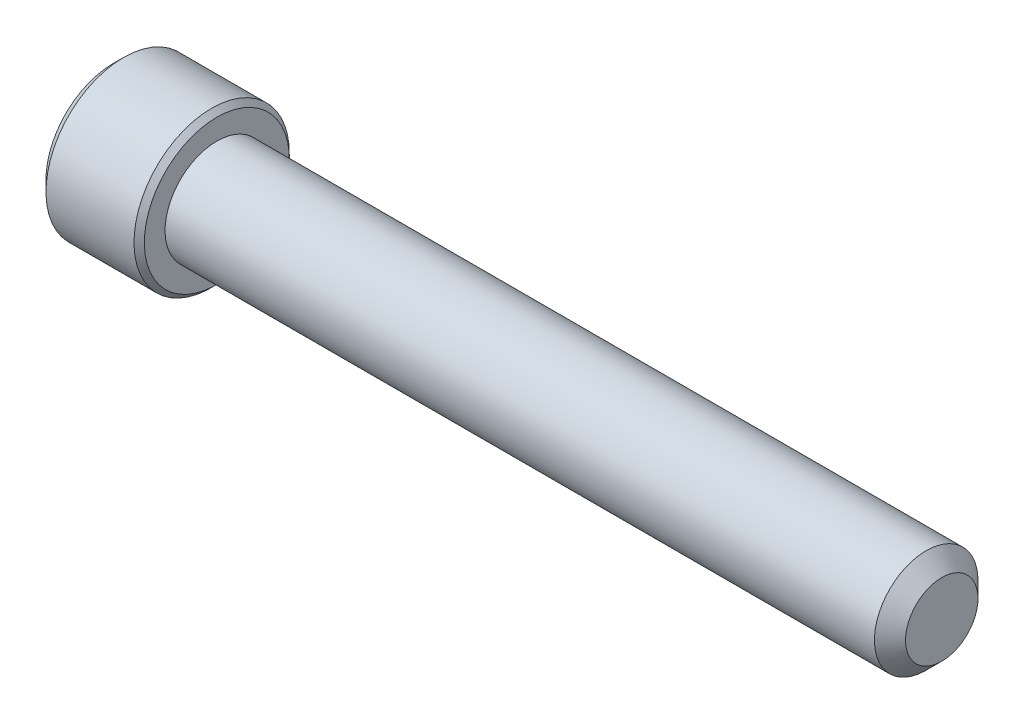
ISO-10303-21;
HEADER;
FILE_DESCRIPTION(('STEP AP214'),'2;1');
FILE_NAME('part.step','',(''),(''),'','','');
FILE_SCHEMA(('AUTOMOTIVE_DESIGN { 1 0 10303 214 1 1 1 1 }'));
ENDSEC;
DATA;
#1=APPLICATION_CONTEXT('core data for automotive mechanical design processes');
#2=APPLICATION_PROTOCOL_DEFINITION('international standard','automotive_design',2000,#1);
#3=PRODUCT_CONTEXT('',#1,'mechanical');
#4=PRODUCT('Part','Part','',(#3));
#5=PRODUCT_RELATED_PRODUCT_CATEGORY('part','',(#4));
#6=PRODUCT_DEFINITION_FORMATION('','',#4);
#7=PRODUCT_DEFINITION_CONTEXT('part definition',#1,'design');
#8=PRODUCT_DEFINITION('design','',#6,#7);
#9=PRODUCT_DEFINITION_SHAPE('','',#8);
#10=(LENGTH_UNIT() NAMED_UNIT(*) SI_UNIT(.MILLI.,.METRE.));
#11=(NAMED_UNIT(*) PLANE_ANGLE_UNIT() SI_UNIT($,.RADIAN.));
#12=(NAMED_UNIT(*) SI_UNIT($,.STERADIAN.) SOLID_ANGLE_UNIT());
#13=UNCERTAINTY_MEASURE_WITH_UNIT(LENGTH_MEASURE(1.E-05),#10,'distance_accuracy_value','');
#14=(GEOMETRIC_REPRESENTATION_CONTEXT(3) GLOBAL_UNCERTAINTY_ASSIGNED_CONTEXT((#13)) GLOBAL_UNIT_ASSIGNED_CONTEXT((#10,
#11,#12)) REPRESENTATION_CONTEXT('',''));
#15=CARTESIAN_POINT('',(0.,0.,0.));
#16=DIRECTION('',(0.,0.,1.));
#17=DIRECTION('',(1.,0.,0.));
#18=AXIS2_PLACEMENT_3D('',#15,#16,#17);
#19=CARTESIAN_POINT('',(-28.575,4.12749999999999,0.));
#20=DIRECTION('',(-1.,0.,0.));
#21=DIRECTION('',(0.,-1.,0.));
#22=AXIS2_PLACEMENT_3D('',#19,#20,#21);
#23=PLANE('',#22);
#24=CARTESIAN_POINT('',(-28.575,0.,0.));
#25=DIRECTION('',(-1.,0.,0.));
#26=DIRECTION('',(0.,-1.,0.));
#27=AXIS2_PLACEMENT_3D('',#24,#25,#26);
#28=CIRCLE('',#27,2.74963065701554);
#29=CARTESIAN_POINT('',(-28.575,-2.74963065701548,-1.90169061053957E-13));
#30=VERTEX_POINT('',#29);
#31=CARTESIAN_POINT('',(-28.575,-1.37481532850788,2.38124999999986));
#32=VERTEX_POINT('',#31);
#33=EDGE_CURVE('E136',#30,#32,#28,.T.);
#34=ORIENTED_EDGE('',*,*,#33,.F.);
#35=CARTESIAN_POINT('',(-28.575,-1.3748153285078,-2.38125));
#36=VERTEX_POINT('',#35);
#37=EDGE_CURVE('E135',#36,#30,#28,.T.);
#38=ORIENTED_EDGE('',*,*,#37,.F.);
#39=CARTESIAN_POINT('',(-28.575,1.37481532850774,-2.38125));
#40=VERTEX_POINT('',#39);
#41=EDGE_CURVE('E105',#40,#36,#28,.T.);
#42=ORIENTED_EDGE('',*,*,#41,.F.);
#43=CARTESIAN_POINT('',(-28.575,2.74963065701559,0.));
#44=VERTEX_POINT('',#43);
#45=EDGE_CURVE('E98',#44,#40,#28,.T.);
#46=ORIENTED_EDGE('',*,*,#45,.F.);
#47=CARTESIAN_POINT('',(-28.575,1.37481532850775,2.38125));
#48=VERTEX_POINT('',#47);
#49=EDGE_CURVE('E59',#48,#44,#28,.T.);
#50=ORIENTED_EDGE('',*,*,#49,.F.);
#51=EDGE_CURVE('E66',#32,#48,#28,.T.);
#52=ORIENTED_EDGE('',*,*,#51,.F.);
#53=EDGE_LOOP('',(#34,#38,#42,#46,#50,#52));
#54=FACE_BOUND('',#53,.T.);
#55=CARTESIAN_POINT('',(-28.575,0.,0.));
#56=DIRECTION('',(1.,0.,0.));
#57=DIRECTION('',(0.,1.,0.));
#58=AXIS2_PLACEMENT_3D('',#55,#56,#57);
#59=CIRCLE('',#58,4.12749999999998);
#60=CARTESIAN_POINT('',(-28.575,4.12749999999999,0.));
#61=VERTEX_POINT('',#60);
#62=EDGE_CURVE('E229',#61,#61,#59,.T.);
#63=ORIENTED_EDGE('',*,*,#62,.F.);
#64=EDGE_LOOP('',(#63));
#65=FACE_BOUND('',#64,.T.);
#66=ADVANCED_FACE('F39',(#54,#65),#23,.T.);
#67=CARTESIAN_POINT('',(-22.225,0.,0.));
#68=DIRECTION('',(1.,0.,0.));
#69=DIRECTION('',(0.,0.,-1.));
#70=AXIS2_PLACEMENT_3D('',#67,#68,#69);
#71=CYLINDRICAL_SURFACE('',#70,3.17499999999999);
#72=CARTESIAN_POINT('',(21.2725,0.,0.));
#73=DIRECTION('',(1.,0.,0.));
#74=DIRECTION('',(0.,0.,-1.));
#75=AXIS2_PLACEMENT_3D('',#72,#73,#74);
#76=CIRCLE('',#75,3.17499999999999);
#77=CARTESIAN_POINT('',(21.2725,0.,-3.17499999999999));
#78=VERTEX_POINT('',#77);
#79=EDGE_CURVE('E53',#78,#78,#76,.F.);
#80=ORIENTED_EDGE('',*,*,#79,.T.);
#81=EDGE_LOOP('',(#80));
#82=FACE_BOUND('',#81,.T.);
#83=CARTESIAN_POINT('',(-22.225,0.,0.));
#84=DIRECTION('',(1.,0.,0.));
#85=DIRECTION('',(0.,1.,0.));
#86=AXIS2_PLACEMENT_3D('',#83,#84,#85);
#87=CIRCLE('',#86,3.17499999999999);
#88=CARTESIAN_POINT('',(-22.225,3.17499999999999,0.));
#89=VERTEX_POINT('',#88);
#90=EDGE_CURVE('E222',#89,#89,#87,.F.);
#91=ORIENTED_EDGE('',*,*,#90,.F.);
#92=EDGE_LOOP('',(#91));
#93=FACE_BOUND('',#92,.T.);
#94=ADVANCED_FACE('F202',(#82,#93),#71,.T.);
#95=CARTESIAN_POINT('',(22.225,0.,0.));
#96=DIRECTION('',(1.,0.,0.));
#97=DIRECTION('',(0.,0.,-1.));
#98=AXIS2_PLACEMENT_3D('',#95,#96,#97);
#99=PLANE('',#98);
#100=CARTESIAN_POINT('',(22.225,0.,0.));
#101=DIRECTION('',(1.,0.,0.));
#102=DIRECTION('',(0.,0.,-1.));
#103=AXIS2_PLACEMENT_3D('',#100,#101,#102);
#104=CIRCLE('',#103,2.2225);
#105=CARTESIAN_POINT('',(22.225,0.,-2.2225));
#106=VERTEX_POINT('',#105);
#107=EDGE_CURVE('E223',#106,#106,#104,.T.);
#108=ORIENTED_EDGE('',*,*,#107,.T.);
#109=EDGE_LOOP('',(#108));
#110=FACE_BOUND('',#109,.T.);
#111=ADVANCED_FACE('F210',(#110),#99,.T.);
#112=CARTESIAN_POINT('',(22.225,0.,0.));
#113=DIRECTION('',(-1.,0.,0.));
#114=DIRECTION('',(0.,0.,1.));
#115=AXIS2_PLACEMENT_3D('',#112,#113,#114);
#116=CONICAL_SURFACE('',#115,2.2225,0.78539816339744);
#117=ORIENTED_EDGE('',*,*,#79,.F.);
#118=EDGE_LOOP('',(#117));
#119=FACE_BOUND('',#118,.T.);
#120=ORIENTED_EDGE('',*,*,#107,.F.);
#121=EDGE_LOOP('',(#120));
#122=FACE_BOUND('',#121,.T.);
#123=ADVANCED_FACE('F41',(#119,#122),#116,.T.);
#124=CARTESIAN_POINT('',(-22.225,0.,0.));
#125=DIRECTION('',(1.,0.,0.));
#126=DIRECTION('',(0.,1.,0.));
#127=AXIS2_PLACEMENT_3D('',#124,#125,#126);
#128=CYLINDRICAL_SURFACE('',#127,4.7625);
#129=CARTESIAN_POINT('',(-27.94,0.,0.));
#130=DIRECTION('',(1.,0.,0.));
#131=DIRECTION('',(0.,1.,0.));
#132=AXIS2_PLACEMENT_3D('',#129,#130,#131);
#133=CIRCLE('',#132,4.76249999999999);
#134=CARTESIAN_POINT('',(-27.94,4.76249999999999,0.));
#135=VERTEX_POINT('',#134);
#136=EDGE_CURVE('E224',#135,#135,#133,.T.);
#137=ORIENTED_EDGE('',*,*,#136,.T.);
#138=EDGE_LOOP('',(#137));
#139=FACE_BOUND('',#138,.T.);
#140=CARTESIAN_POINT('',(-22.5425,0.,0.));
#141=DIRECTION('',(1.,0.,0.));
#142=DIRECTION('',(0.,1.,0.));
#143=AXIS2_PLACEMENT_3D('',#140,#141,#142);
#144=CIRCLE('',#143,4.7625);
#145=CARTESIAN_POINT('',(-22.5425,4.76249999999999,0.));
#146=VERTEX_POINT('',#145);
#147=EDGE_CURVE('E237',#146,#146,#144,.T.);
#148=ORIENTED_EDGE('',*,*,#147,.F.);
#149=EDGE_LOOP('',(#148));
#150=FACE_BOUND('',#149,.T.);
#151=ADVANCED_FACE('F205',(#139,#150),#128,.T.);
#152=CARTESIAN_POINT('',(-27.94,0.,0.));
#153=DIRECTION('',(1.,0.,0.));
#154=DIRECTION('',(0.,1.,0.));
#155=AXIS2_PLACEMENT_3D('',#152,#153,#154);
#156=CONICAL_SURFACE('',#155,4.76249999999999,0.785398163397454);
#157=ORIENTED_EDGE('',*,*,#62,.T.);
#158=EDGE_LOOP('',(#157));
#159=FACE_BOUND('',#158,.T.);
#160=ORIENTED_EDGE('',*,*,#136,.F.);
#161=EDGE_LOOP('',(#160));
#162=FACE_BOUND('',#161,.T.);
#163=ADVANCED_FACE('F198',(#159,#162),#156,.T.);
#164=CARTESIAN_POINT('',(-22.225,4.44499999999999,0.));
#165=DIRECTION('',(1.,0.,0.));
#166=DIRECTION('',(0.,1.,0.));
#167=AXIS2_PLACEMENT_3D('',#164,#165,#166);
#168=PLANE('',#167);
#169=ORIENTED_EDGE('',*,*,#90,.T.);
#170=EDGE_LOOP('',(#169));
#171=FACE_BOUND('',#170,.T.);
#172=CARTESIAN_POINT('',(-22.225,0.,0.));
#173=DIRECTION('',(1.,0.,0.));
#174=DIRECTION('',(0.,1.,0.));
#175=AXIS2_PLACEMENT_3D('',#172,#173,#174);
#176=CIRCLE('',#175,4.445);
#177=CARTESIAN_POINT('',(-22.225,4.44499999999999,0.));
#178=VERTEX_POINT('',#177);
#179=EDGE_CURVE('E234',#178,#178,#176,.T.);
#180=ORIENTED_EDGE('',*,*,#179,.T.);
#181=EDGE_LOOP('',(#180));
#182=FACE_BOUND('',#181,.T.);
#183=ADVANCED_FACE('F194',(#171,#182),#168,.T.);
#184=CARTESIAN_POINT('',(-22.225,0.,0.));
#185=DIRECTION('',(-1.,0.,0.));
#186=DIRECTION('',(0.,-1.,0.));
#187=AXIS2_PLACEMENT_3D('',#184,#185,#186);
#188=CONICAL_SURFACE('',#187,4.445,0.78539816339745);
#189=ORIENTED_EDGE('',*,*,#147,.T.);
#190=EDGE_LOOP('',(#189));
#191=FACE_BOUND('',#190,.T.);
#192=ORIENTED_EDGE('',*,*,#179,.F.);
#193=EDGE_LOOP('',(#192));
#194=FACE_BOUND('',#193,.T.);
#195=ADVANCED_FACE('F158',(#191,#194),#188,.T.);
#196=CARTESIAN_POINT('',(-28.575,0.,0.));
#197=DIRECTION('',(-1.,0.,0.));
#198=DIRECTION('',(0.,-1.,0.));
#199=AXIS2_PLACEMENT_3D('',#196,#197,#198);
#200=CONICAL_SURFACE('',#199,2.74963065701554,0.78539816339745);
#201=CARTESIAN_POINT('',(-29.4726170860818,-2.76261914440418,-2.38125));
#202=CARTESIAN_POINT('',(-29.4217472146642,-2.69544479536901,-2.38125));
#203=CARTESIAN_POINT('',(-29.371362945559,-2.62789666157822,-2.38125));
#204=CARTESIAN_POINT('',(-29.2717837708365,-2.4919044897762,-2.38125));
#205=CARTESIAN_POINT('',(-29.222589164007,-2.42346023321902,-2.38125));
#206=CARTESIAN_POINT('',(-29.1252575507658,-2.28502676073672,-2.38125));
#207=CARTESIAN_POINT('',(-29.0771316856913,-2.21502968492294,-2.38125));
#208=CARTESIAN_POINT('',(-28.9826556101339,-2.07385103549329,-2.38125));
#209=CARTESIAN_POINT('',(-28.936305274774,-2.00266954568683,-2.38125));
#210=CARTESIAN_POINT('',(-28.8431368561696,-1.85474026844004,-2.38125));
#211=CARTESIAN_POINT('',(-28.79644913765,-1.77790995637348,-2.38125));
#212=CARTESIAN_POINT('',(-28.7061296058591,-1.62247617017444,-2.38125));
#213=CARTESIAN_POINT('',(-28.6624973902756,-1.54387293128847,-2.38125));
#214=CARTESIAN_POINT('',(-28.5792071100283,-1.3848627213771,-2.38125));
#215=CARTESIAN_POINT('',(-28.5395379009362,-1.30446163393303,-2.38125));
#216=CARTESIAN_POINT('',(-28.4650690459264,-1.14145314547585,-2.38125));
#217=CARTESIAN_POINT('',(-28.4302671796136,-1.05884677109138,-2.38125));
#218=CARTESIAN_POINT('',(-28.369429813229,-0.898296083334517,-2.38125));
#219=CARTESIAN_POINT('',(-28.3429047139327,-0.820539229733715,-2.38125));
#220=CARTESIAN_POINT('',(-28.2960898392086,-0.663135380856713,-2.38125));
#221=CARTESIAN_POINT('',(-28.275800487612,-0.583488257498823,-2.38125));
#222=CARTESIAN_POINT('',(-28.2428604073913,-0.424114177096804,-2.38125));
#223=CARTESIAN_POINT('',(-28.2300775337025,-0.344414987504222,-2.38125));
#224=CARTESIAN_POINT('',(-28.2124018129256,-0.184141832361576,-2.38125));
#225=CARTESIAN_POINT('',(-28.2075075663141,-0.103568024531849,-2.38125));
#226=CARTESIAN_POINT('',(-28.2059814589762,0.0546452704451861,-2.38125));
#227=CARTESIAN_POINT('',(-28.2090477837949,0.13228193581618,-2.38125));
#228=CARTESIAN_POINT('',(-28.2226029014609,0.28689976181788,-2.38125));
#229=CARTESIAN_POINT('',(-28.2330924083037,0.363880858672124,-2.38125));
#230=CARTESIAN_POINT('',(-28.2610957916784,0.517934845552167,-2.38125));
#231=CARTESIAN_POINT('',(-28.2787299282364,0.594985552514235,-2.38125));
#232=CARTESIAN_POINT('',(-28.3200790150025,0.747397784971305,-2.38125));
#233=CARTESIAN_POINT('',(-28.3437934823661,0.822759444078608,-2.38125));
#234=CARTESIAN_POINT('',(-28.4271079749025,1.0591084974007,-2.38125));
#235=CARTESIAN_POINT('',(-28.4961581302676,1.21677702097597,-2.38125));
#236=CARTESIAN_POINT('',(-28.6112600462424,1.44750538913544,-2.38125));
#237=CARTESIAN_POINT('',(-28.6516390556527,1.52359597394727,-2.38125));
#238=CARTESIAN_POINT('',(-28.7355045047098,1.67404919579938,-2.38125));
#239=CARTESIAN_POINT('',(-28.7789903868604,1.74841213968925,-2.38125));
#240=CARTESIAN_POINT('',(-28.866219749271,1.89195740305349,-2.38125));
#241=CARTESIAN_POINT('',(-28.909843103173,1.96121355997412,-2.38125));
#242=CARTESIAN_POINT('',(-28.9989297072439,2.09853826165523,-2.38125));
#243=CARTESIAN_POINT('',(-29.0443930965357,2.16660671605607,-2.38125));
#244=CARTESIAN_POINT('',(-29.1364552844235,2.30115854912699,-2.38125));
#245=CARTESIAN_POINT('',(-29.1830418918462,2.36765030390084,-2.38125));
#246=CARTESIAN_POINT('',(-29.2774503249111,2.49972444191928,-2.38125));
#247=CARTESIAN_POINT('',(-29.3252718071541,2.56530707034484,-2.38125));
#248=CARTESIAN_POINT('',(-29.3735984122085,2.63050906958841,-2.38125));
#249=B_SPLINE_CURVE_WITH_KNOTS('',3,(#201,#202,#203,#204,#205,#206,#207,#208,#209,#210,#211,
#212,#213,#214,#215,#216,#217,#218,#219,#220,#221,#222,#223,#224,#225,#226,#227,#228,#229,#230,
#231,#232,#233,#234,#235,#236,#237,#238,#239,#240,#241,#242,#243,#244,#245,#246,#247,#248),
.UNSPECIFIED.,.F.,.F.,(4,2,2,2,2,2,2,2,2,2,2,2,2,2,2,2,2,2,2,2,2,2,2,4),(0.,0.252791871598828,
0.505646586889977,0.76045956221371,1.01525458294594,1.28490904202322,1.55452792920366,
1.82336591151048,2.09208085189149,2.3383348822785,2.58460564635833,2.82639989379209,
3.06815123972673,3.30087188936529,3.5336149261831,3.77045005614648,4.00726638464211,
4.52203846871508,4.78044014408772,5.03879556784405,5.28431582225896,5.52985467496293,
5.77340315409172,6.01688462048994),.UNSPECIFIED.);
#250=EDGE_CURVE('E11',#36,#40,#249,.T.);
#251=ORIENTED_EDGE('',*,*,#250,.T.);
#252=ORIENTED_EDGE('',*,*,#41,.T.);
#253=EDGE_LOOP('',(#251,#252));
#254=FACE_BOUND('',#253,.T.);
#255=ADVANCED_FACE('F110',(#254),#200,.F.);
#256=CARTESIAN_POINT('',(-28.5751154773274,-2.74974612706943,0.000199999999999951));
#257=CARTESIAN_POINT('',(-28.5278948967097,-2.70248609172789,-0.0816567823790515));
#258=CARTESIAN_POINT('',(-28.483447575293,-2.65443579722785,-0.164882333771763));
#259=CARTESIAN_POINT('',(-28.4020654569857,-2.556455907536,-0.334588480838045));
#260=CARTESIAN_POINT('',(-28.3651759430953,-2.506516993425,-0.421085217353108));
#261=CARTESIAN_POINT('',(-28.301983413166,-2.40581754748857,-0.59550177400905));
#262=CARTESIAN_POINT('',(-28.2755215587296,-2.35508266327638,-0.683377171180684));
#263=CARTESIAN_POINT('',(-28.2347515156162,-2.25249593653965,-0.861062594070888));
#264=CARTESIAN_POINT('',(-28.2204128915307,-2.20064722822084,-0.950867191185885));
#265=CARTESIAN_POINT('',(-28.2074757847702,-2.11128933452157,-1.10563960313036));
#266=CARTESIAN_POINT('',(-28.2055606046533,-2.07389560129143,-1.17040744896964));
#267=CARTESIAN_POINT('',(-28.2087866227678,-1.99916925388848,-1.29983727933559));
#268=CARTESIAN_POINT('',(-28.2139302948572,-1.9618366657362,-1.36449921879338));
#269=CARTESIAN_POINT('',(-28.2309813108717,-1.88752399013709,-1.49321254857742));
#270=CARTESIAN_POINT('',(-28.2428962213494,-1.85054434417199,-1.55726317423488));
#271=CARTESIAN_POINT('',(-28.2728356723521,-1.77722451768915,-1.6842568389053));
#272=CARTESIAN_POINT('',(-28.2908597445186,-1.74088428837515,-1.74719996243585));
#273=CARTESIAN_POINT('',(-28.3443688075525,-1.64780030516183,-1.9084261507322));
#274=CARTESIAN_POINT('',(-28.3838874208723,-1.59163374230436,-2.00570949128786));
#275=CARTESIAN_POINT('',(-28.4506003435509,-1.50904576583587,-2.14875606262558));
#276=CARTESIAN_POINT('',(-28.4740402091114,-1.48182934348129,-2.19589628894397));
#277=CARTESIAN_POINT('',(-28.5230566766596,-1.42790064981105,-2.28930352636664));
#278=CARTESIAN_POINT('',(-28.5486319667669,-1.40118808114505,-2.33557105249682));
#279=CARTESIAN_POINT('',(-28.5751154773273,-1.37469985845396,-2.38145));
#280=B_SPLINE_CURVE_WITH_KNOTS('',3,(#256,#257,#258,#259,#260,#261,#262,#263,#264,#265,#266,
#267,#268,#269,#270,#271,#272,#273,#274,#275,#276,#277,#278,#279),.UNSPECIFIED.,.F.,.F.,(4,2,2,
2,2,2,2,2,2,2,2,4),(0.,0.317196610611954,0.636241461041227,0.950218950629237,1.26340583824128,
1.48752413747846,1.7117210016775,1.93616888974085,2.16059957440839,2.51709639744764,
2.69486147369099,2.87251813383153),.UNSPECIFIED.);
#281=EDGE_CURVE('E138',#30,#36,#280,.T.);
#282=ORIENTED_EDGE('',*,*,#281,.T.);
#283=ORIENTED_EDGE('',*,*,#37,.T.);
#284=EDGE_LOOP('',(#282,#283));
#285=FACE_BOUND('',#284,.T.);
#286=ADVANCED_FACE('F157',(#285),#200,.F.);
#287=CARTESIAN_POINT('',(-28.5751154773273,-1.37469985845396,2.38145));
#288=CARTESIAN_POINT('',(-28.5278948967096,-1.4219598937955,2.29959321762095));
#289=CARTESIAN_POINT('',(-28.483447575293,-1.47001018829553,2.21636766622824));
#290=CARTESIAN_POINT('',(-28.4020654569857,-1.56799007798738,2.04666151916197));
#291=CARTESIAN_POINT('',(-28.3651759430952,-1.61792899209838,1.9601647826469));
#292=CARTESIAN_POINT('',(-28.301983413166,-1.71862843803481,1.78574822599097));
#293=CARTESIAN_POINT('',(-28.2755215587296,-1.769363322247,1.69787282881934));
#294=CARTESIAN_POINT('',(-28.2347515156162,-1.87195004898372,1.52018740592914));
#295=CARTESIAN_POINT('',(-28.2204128915307,-1.92379875730253,1.43038280881415));
#296=CARTESIAN_POINT('',(-28.2074757847702,-2.0131566510018,1.27561039686968));
#297=CARTESIAN_POINT('',(-28.2055606046533,-2.05055038423194,1.2108425510304));
#298=CARTESIAN_POINT('',(-28.2087866227678,-2.12527673163489,1.08141272066444));
#299=CARTESIAN_POINT('',(-28.2139302948572,-2.16260931978716,1.01675078120666));
#300=CARTESIAN_POINT('',(-28.2309813108717,-2.23692199538627,0.888037451422617));
#301=CARTESIAN_POINT('',(-28.2428962213494,-2.27390164135137,0.823986825765159));
#302=CARTESIAN_POINT('',(-28.2728356723521,-2.34722146783422,0.696993161094738));
#303=CARTESIAN_POINT('',(-28.2908597445186,-2.38356169714822,0.634050037564186));
#304=CARTESIAN_POINT('',(-28.3443688075525,-2.47664568036154,0.472823849267827));
#305=CARTESIAN_POINT('',(-28.3838874208723,-2.53281224321901,0.375540508712166));
#306=CARTESIAN_POINT('',(-28.4506003435509,-2.61540021968751,0.232493937374435));
#307=CARTESIAN_POINT('',(-28.4740402091115,-2.64261664204209,0.18535371105604));
#308=CARTESIAN_POINT('',(-28.5230566766597,-2.69654533571233,0.0919464736333651));
#309=CARTESIAN_POINT('',(-28.548631966767,-2.72325790437833,0.045678947503181));
#310=CARTESIAN_POINT('',(-28.5751154773274,-2.74974612706943,-0.000199999999998717));
#311=B_SPLINE_CURVE_WITH_KNOTS('',3,(#287,#288,#289,#290,#291,#292,#293,#294,#295,#296,#297,
#298,#299,#300,#301,#302,#303,#304,#305,#306,#307,#308,#309,#310),.UNSPECIFIED.,.F.,.F.,(4,2,2,
2,2,2,2,2,2,2,2,4),(0.,0.317196610611941,0.636241461041204,0.950218950629199,1.26340583824123,
1.48752413747841,1.71172100167745,1.9361688897408,2.16059957440834,2.51709639744762,
2.69486147369098,2.87251813383153),.UNSPECIFIED.);
#312=EDGE_CURVE('E145',#32,#30,#311,.T.);
#313=ORIENTED_EDGE('',*,*,#312,.T.);
#314=ORIENTED_EDGE('',*,*,#33,.T.);
#315=EDGE_LOOP('',(#313,#314));
#316=FACE_BOUND('',#315,.T.);
#317=ADVANCED_FACE('F270',(#316),#200,.F.);
#318=CARTESIAN_POINT('',(-29.4726170860818,-2.76261914440418,2.38125));
#319=CARTESIAN_POINT('',(-29.4217472146642,-2.69544479536901,2.38125));
#320=CARTESIAN_POINT('',(-29.371362945559,-2.62789666157822,2.38125));
#321=CARTESIAN_POINT('',(-29.2717837708365,-2.49190448977619,2.38125));
#322=CARTESIAN_POINT('',(-29.222589164007,-2.42346023321902,2.38125));
#323=CARTESIAN_POINT('',(-29.1252575507658,-2.28502676073672,2.38125));
#324=CARTESIAN_POINT('',(-29.0771316856913,-2.21502968492294,2.38125));
#325=CARTESIAN_POINT('',(-28.9826556101339,-2.07385103549329,2.38125));
#326=CARTESIAN_POINT('',(-28.936305274774,-2.00266954568683,2.38125));
#327=CARTESIAN_POINT('',(-28.8431368561696,-1.85474026844004,2.38125));
#328=CARTESIAN_POINT('',(-28.79644913765,-1.77790995637347,2.38125));
#329=CARTESIAN_POINT('',(-28.7061296058591,-1.62247617017444,2.38125));
#330=CARTESIAN_POINT('',(-28.6624973902756,-1.54387293128847,2.38125));
#331=CARTESIAN_POINT('',(-28.5792071100283,-1.3848627213771,2.38125));
#332=CARTESIAN_POINT('',(-28.5395379009362,-1.30446163393303,2.38125));
#333=CARTESIAN_POINT('',(-28.4650690459264,-1.14145314547585,2.38125));
#334=CARTESIAN_POINT('',(-28.4302671796136,-1.05884677109138,2.38125));
#335=CARTESIAN_POINT('',(-28.369429813229,-0.898296083334517,2.38125));
#336=CARTESIAN_POINT('',(-28.3429047139327,-0.820539229733715,2.38125));
#337=CARTESIAN_POINT('',(-28.2960898392086,-0.663135380856713,2.38125));
#338=CARTESIAN_POINT('',(-28.275800487612,-0.583488257498822,2.38125));
#339=CARTESIAN_POINT('',(-28.2428604073913,-0.424114177096803,2.38125));
#340=CARTESIAN_POINT('',(-28.2300775337025,-0.344414987504221,2.38125));
#341=CARTESIAN_POINT('',(-28.2124018129256,-0.184141832361575,2.38125));
#342=CARTESIAN_POINT('',(-28.2075075663141,-0.103568024531848,2.38125));
#343=CARTESIAN_POINT('',(-28.2059814589762,0.0546452704451873,2.38125));
#344=CARTESIAN_POINT('',(-28.2090477837949,0.132281935816181,2.38125));
#345=CARTESIAN_POINT('',(-28.2226029014609,0.286899761817881,2.38125));
#346=CARTESIAN_POINT('',(-28.2330924083037,0.363880858672125,2.38125));
#347=CARTESIAN_POINT('',(-28.2610957916784,0.517934845552167,2.38125));
#348=CARTESIAN_POINT('',(-28.2787299282364,0.594985552514235,2.38125));
#349=CARTESIAN_POINT('',(-28.3200790150025,0.747397784971305,2.38125));
#350=CARTESIAN_POINT('',(-28.3437934823661,0.822759444078608,2.38125));
#351=CARTESIAN_POINT('',(-28.4271079749025,1.0591084974007,2.38125));
#352=CARTESIAN_POINT('',(-28.4961581302676,1.21677702097597,2.38125));
#353=CARTESIAN_POINT('',(-28.6112600462424,1.44750538913543,2.38125));
#354=CARTESIAN_POINT('',(-28.6516390556527,1.52359597394727,2.38125));
#355=CARTESIAN_POINT('',(-28.7355045047098,1.67404919579937,2.38125));
#356=CARTESIAN_POINT('',(-28.7789903868604,1.74841213968924,2.38125));
#357=CARTESIAN_POINT('',(-28.866219749271,1.89195740305349,2.38125));
#358=CARTESIAN_POINT('',(-28.909843103173,1.96121355997412,2.38125));
#359=CARTESIAN_POINT('',(-28.9989297072439,2.09853826165523,2.38125));
#360=CARTESIAN_POINT('',(-29.0443930965357,2.16660671605607,2.38125));
#361=CARTESIAN_POINT('',(-29.1364552844235,2.30115854912699,2.38125));
#362=CARTESIAN_POINT('',(-29.1830418918462,2.36765030390084,2.38125));
#363=CARTESIAN_POINT('',(-29.2774503249111,2.49972444191928,2.38125));
#364=CARTESIAN_POINT('',(-29.3252718071541,2.56530707034484,2.38125));
#365=CARTESIAN_POINT('',(-29.3735984122085,2.63050906958841,2.38125));
#366=B_SPLINE_CURVE_WITH_KNOTS('',3,(#318,#319,#320,#321,#322,#323,#324,#325,#326,#327,#328,
#329,#330,#331,#332,#333,#334,#335,#336,#337,#338,#339,#340,#341,#342,#343,#344,#345,#346,#347,
#348,#349,#350,#351,#352,#353,#354,#355,#356,#357,#358,#359,#360,#361,#362,#363,#364,#365),
.UNSPECIFIED.,.F.,.F.,(4,2,2,2,2,2,2,2,2,2,2,2,2,2,2,2,2,2,2,2,2,2,2,4),(0.,0.252791871598829,
0.505646586889978,0.760459562213708,1.01525458294594,1.28490904202322,1.55452792920366,
1.82336591151048,2.09208085189149,2.3383348822785,2.58460564635832,2.82639989379209,
3.06815123972673,3.30087188936529,3.5336149261831,3.77045005614648,4.0072663846421,
4.52203846871507,4.78044014408771,5.03879556784404,5.28431582225896,5.52985467496293,
5.77340315409173,6.01688462048994),.UNSPECIFIED.);
#367=EDGE_CURVE('E165',#48,#32,#366,.F.);
#368=ORIENTED_EDGE('',*,*,#367,.T.);
#369=ORIENTED_EDGE('',*,*,#51,.T.);
#370=EDGE_LOOP('',(#368,#369));
#371=FACE_BOUND('',#370,.T.);
#372=ADVANCED_FACE('F286',(#371),#200,.F.);
#373=CARTESIAN_POINT('',(-28.5751154773272,2.74974612706943,-0.000200000000000382));
#374=CARTESIAN_POINT('',(-28.5278948967095,2.70248609172789,0.0816567823790488));
#375=CARTESIAN_POINT('',(-28.4834475752929,2.65443579722786,0.164882333771757));
#376=CARTESIAN_POINT('',(-28.4020654569856,2.55645590753601,0.334588480838033));
#377=CARTESIAN_POINT('',(-28.3651759430951,2.50651699342501,0.421085217353095));
#378=CARTESIAN_POINT('',(-28.3019834131659,2.40581754748858,0.595501774009031));
#379=CARTESIAN_POINT('',(-28.2755215587295,2.35508266327639,0.683377171180662));
#380=CARTESIAN_POINT('',(-28.2347515156161,2.25249593653966,0.861062594070859));
#381=CARTESIAN_POINT('',(-28.2204128915306,2.20064722822086,0.950867191185853));
#382=CARTESIAN_POINT('',(-28.2074757847701,2.11128933452159,1.10563960313032));
#383=CARTESIAN_POINT('',(-28.2055606046532,2.07389560129145,1.1704074489696));
#384=CARTESIAN_POINT('',(-28.2087866227677,1.9991692538885,1.29983727933555));
#385=CARTESIAN_POINT('',(-28.2139302948571,1.96183666573623,1.36449921879333));
#386=CARTESIAN_POINT('',(-28.2309813108716,1.88752399013712,1.49321254857737));
#387=CARTESIAN_POINT('',(-28.2428962213493,1.85054434417202,1.55726317423483));
#388=CARTESIAN_POINT('',(-28.272835672352,1.77722451768918,1.68425683890524));
#389=CARTESIAN_POINT('',(-28.2908597445185,1.74088428837518,1.74719996243579));
#390=CARTESIAN_POINT('',(-28.3443688075524,1.64780030516186,1.90842615073215));
#391=CARTESIAN_POINT('',(-28.3838874208722,1.59163374230438,2.00570949128782));
#392=CARTESIAN_POINT('',(-28.4506003435508,1.50904576583589,2.14875606262556));
#393=CARTESIAN_POINT('',(-28.4740402091113,1.4818293434813,2.19589628894395));
#394=CARTESIAN_POINT('',(-28.5230566766596,1.42790064981106,2.28930352636663));
#395=CARTESIAN_POINT('',(-28.5486319667669,1.40118808114506,2.33557105249682));
#396=CARTESIAN_POINT('',(-28.5751154773273,1.37469985845396,2.38145));
#397=B_SPLINE_CURVE_WITH_KNOTS('',3,(#373,#374,#375,#376,#377,#378,#379,#380,#381,#382,#383,
#384,#385,#386,#387,#388,#389,#390,#391,#392,#393,#394,#395,#396),.UNSPECIFIED.,.F.,.F.,(4,2,2,
2,2,2,2,2,2,2,2,4),(0.,0.317196610611943,0.636241461041207,0.950218950629204,1.26340583824124,
1.48752413747841,1.71172100167744,1.93616888974078,2.16059957440832,2.51709639744761,
2.69486147369098,2.87251813383154),.UNSPECIFIED.);
#398=EDGE_CURVE('E125',#44,#48,#397,.T.);
#399=ORIENTED_EDGE('',*,*,#398,.T.);
#400=ORIENTED_EDGE('',*,*,#49,.T.);
#401=EDGE_LOOP('',(#399,#400));
#402=FACE_BOUND('',#401,.T.);
#403=ADVANCED_FACE('F262',(#402),#200,.F.);
#404=CARTESIAN_POINT('',(-28.5751154773273,1.37469985845396,-2.38145));
#405=CARTESIAN_POINT('',(-28.5278948967096,1.4219598937955,-2.29959321762095));
#406=CARTESIAN_POINT('',(-28.4834475752929,1.47001018829554,-2.21636766622824));
#407=CARTESIAN_POINT('',(-28.4020654569856,1.56799007798739,-2.04666151916196));
#408=CARTESIAN_POINT('',(-28.3651759430951,1.61792899209839,-1.96016478264689));
#409=CARTESIAN_POINT('',(-28.3019834131659,1.71862843803482,-1.78574822599095));
#410=CARTESIAN_POINT('',(-28.2755215587295,1.76936332224701,-1.69787282881932));
#411=CARTESIAN_POINT('',(-28.2347515156161,1.87195004898374,-1.52018740592911));
#412=CARTESIAN_POINT('',(-28.2204128915306,1.92379875730255,-1.43038280881412));
#413=CARTESIAN_POINT('',(-28.2074757847701,2.01315665100182,-1.27561039686965));
#414=CARTESIAN_POINT('',(-28.2055606046532,2.05055038423196,-1.21084255103037));
#415=CARTESIAN_POINT('',(-28.2087866227677,2.12527673163491,-1.08141272066442));
#416=CARTESIAN_POINT('',(-28.2139302948571,2.16260931978718,-1.01675078120664));
#417=CARTESIAN_POINT('',(-28.2309813108716,2.23692199538629,-0.888037451422596));
#418=CARTESIAN_POINT('',(-28.2428962213493,2.27390164135138,-0.82398682576514));
#419=CARTESIAN_POINT('',(-28.272835672352,2.34722146783423,-0.696993161094722));
#420=CARTESIAN_POINT('',(-28.2908597445184,2.38356169714823,-0.634050037564172));
#421=CARTESIAN_POINT('',(-28.3443688075524,2.47664568036154,-0.472823849267816));
#422=CARTESIAN_POINT('',(-28.3838874208722,2.53281224321902,-0.375540508712159));
#423=CARTESIAN_POINT('',(-28.4506003435508,2.61540021968751,-0.232493937374429));
#424=CARTESIAN_POINT('',(-28.4740402091113,2.64261664204209,-0.185353711056034));
#425=CARTESIAN_POINT('',(-28.5230566766595,2.69654533571233,-0.0919464736333602));
#426=CARTESIAN_POINT('',(-28.5486319667668,2.72325790437833,-0.0456789475031773));
#427=CARTESIAN_POINT('',(-28.5751154773272,2.74974612706943,0.000200000000000434));
#428=B_SPLINE_CURVE_WITH_KNOTS('',3,(#404,#405,#406,#407,#408,#409,#410,#411,#412,#413,#414,
#415,#416,#417,#418,#419,#420,#421,#422,#423,#424,#425,#426,#427),.UNSPECIFIED.,.F.,.F.,(4,2,2,
2,2,2,2,2,2,2,2,4),(0.,0.317196610611953,0.636241461041229,0.950218950629238,1.26340583824128,
1.48752413747846,1.71172100167748,1.93616888974083,2.16059957440837,2.51709639744763,
2.69486147369099,2.87251813383154),.UNSPECIFIED.);
#429=EDGE_CURVE('E101',#40,#44,#428,.T.);
#430=ORIENTED_EDGE('',*,*,#429,.T.);
#431=ORIENTED_EDGE('',*,*,#45,.T.);
#432=EDGE_LOOP('',(#430,#431));
#433=FACE_BOUND('',#432,.T.);
#434=ADVANCED_FACE('F99',(#433),#200,.F.);
#435=CARTESIAN_POINT('',(-25.527,2.74963065701559,0.));
#436=DIRECTION('',(1.,0.,0.));
#437=DIRECTION('',(0.,0.,-1.));
#438=AXIS2_PLACEMENT_3D('',#435,#436,#437);
#439=PLANE('',#438);
#440=DIRECTION('',(0.,0.5,0.866025403784439));
#441=VECTOR('',#440,1.);
#442=CARTESIAN_POINT('',(-25.527,1.3748153285078,-2.38125));
#443=LINE('',#442,#441);
#444=CARTESIAN_POINT('',(-25.527,1.3748153285078,-2.38125));
#445=VERTEX_POINT('',#444);
#446=CARTESIAN_POINT('',(-25.527,2.74963065701559,0.));
#447=VERTEX_POINT('',#446);
#448=EDGE_CURVE('E124',#445,#447,#443,.T.);
#449=ORIENTED_EDGE('',*,*,#448,.F.);
#450=DIRECTION('',(0.,1.,0.));
#451=VECTOR('',#450,1.);
#452=CARTESIAN_POINT('',(-25.527,-1.3748153285078,-2.38125));
#453=LINE('',#452,#451);
#454=CARTESIAN_POINT('',(-25.527,-1.3748153285078,-2.38125));
#455=VERTEX_POINT('',#454);
#456=EDGE_CURVE('E129',#455,#445,#453,.T.);
#457=ORIENTED_EDGE('',*,*,#456,.F.);
#458=DIRECTION('',(0.,0.5,-0.866025403784439));
#459=VECTOR('',#458,1.);
#460=CARTESIAN_POINT('',(-25.527,-2.74963065701559,0.));
#461=LINE('',#460,#459);
#462=CARTESIAN_POINT('',(-25.527,-2.74963065701559,0.));
#463=VERTEX_POINT('',#462);
#464=EDGE_CURVE('E252',#463,#455,#461,.T.);
#465=ORIENTED_EDGE('',*,*,#464,.F.);
#466=DIRECTION('',(0.,-0.5,-0.866025403784439));
#467=VECTOR('',#466,1.);
#468=CARTESIAN_POINT('',(-25.527,-1.3748153285078,2.38125));
#469=LINE('',#468,#467);
#470=CARTESIAN_POINT('',(-25.527,-1.3748153285078,2.38125));
#471=VERTEX_POINT('',#470);
#472=EDGE_CURVE('E254',#471,#463,#469,.T.);
#473=ORIENTED_EDGE('',*,*,#472,.F.);
#474=DIRECTION('',(0.,-1.,0.));
#475=VECTOR('',#474,1.);
#476=CARTESIAN_POINT('',(-25.527,1.3748153285078,2.38125));
#477=LINE('',#476,#475);
#478=CARTESIAN_POINT('',(-25.527,1.3748153285078,2.38125));
#479=VERTEX_POINT('',#478);
#480=EDGE_CURVE('E256',#479,#471,#477,.T.);
#481=ORIENTED_EDGE('',*,*,#480,.F.);
#482=DIRECTION('',(0.,-0.5,0.866025403784439));
#483=VECTOR('',#482,1.);
#484=CARTESIAN_POINT('',(-25.527,2.74963065701559,0.));
#485=LINE('',#484,#483);
#486=EDGE_CURVE('E258',#447,#479,#485,.T.);
#487=ORIENTED_EDGE('',*,*,#486,.F.);
#488=EDGE_LOOP('',(#449,#457,#465,#473,#481,#487));
#489=FACE_BOUND('',#488,.T.);
#490=ADVANCED_FACE('F159',(#489),#439,.F.);
#491=CARTESIAN_POINT('',(-25.527,-1.3748153285078,-2.38125));
#492=DIRECTION('',(0.,0.,1.));
#493=DIRECTION('',(0.,-1.,0.));
#494=AXIS2_PLACEMENT_3D('',#491,#492,#493);
#495=PLANE('',#494);
#496=ORIENTED_EDGE('',*,*,#250,.F.);
#497=DIRECTION('',(-1.,0.,0.));
#498=VECTOR('',#497,1.);
#499=CARTESIAN_POINT('',(-25.527,-1.3748153285078,-2.38125));
#500=LINE('',#499,#498);
#501=EDGE_CURVE('E130',#455,#36,#500,.T.);
#502=ORIENTED_EDGE('',*,*,#501,.F.);
#503=ORIENTED_EDGE('',*,*,#456,.T.);
#504=DIRECTION('',(-1.,0.,0.));
#505=VECTOR('',#504,1.);
#506=CARTESIAN_POINT('',(-25.527,1.3748153285078,-2.38125));
#507=LINE('',#506,#505);
#508=EDGE_CURVE('E120',#445,#40,#507,.T.);
#509=ORIENTED_EDGE('',*,*,#508,.T.);
#510=EDGE_LOOP('',(#496,#502,#503,#509));
#511=FACE_BOUND('',#510,.T.);
#512=ADVANCED_FACE('F127',(#511),#495,.T.);
#513=CARTESIAN_POINT('',(-25.527,-2.74963065701559,0.));
#514=DIRECTION('',(0.,0.866025403784439,0.5));
#515=DIRECTION('',(0.,-0.5,0.866025403784439));
#516=AXIS2_PLACEMENT_3D('',#513,#514,#515);
#517=PLANE('',#516);
#518=ORIENTED_EDGE('',*,*,#281,.F.);
#519=DIRECTION('',(-1.,0.,0.));
#520=VECTOR('',#519,1.);
#521=CARTESIAN_POINT('',(-25.527,-2.74963065701559,0.));
#522=LINE('',#521,#520);
#523=EDGE_CURVE('E247',#463,#30,#522,.T.);
#524=ORIENTED_EDGE('',*,*,#523,.F.);
#525=ORIENTED_EDGE('',*,*,#464,.T.);
#526=ORIENTED_EDGE('',*,*,#501,.T.);
#527=EDGE_LOOP('',(#518,#524,#525,#526));
#528=FACE_BOUND('',#527,.T.);
#529=ADVANCED_FACE('F152',(#528),#517,.T.);
#530=CARTESIAN_POINT('',(-25.527,-1.3748153285078,2.38125));
#531=DIRECTION('',(0.,0.866025403784439,-0.5));
#532=DIRECTION('',(0.,0.5,0.866025403784439));
#533=AXIS2_PLACEMENT_3D('',#530,#531,#532);
#534=PLANE('',#533);
#535=ORIENTED_EDGE('',*,*,#312,.F.);
#536=DIRECTION('',(-1.,0.,0.));
#537=VECTOR('',#536,1.);
#538=CARTESIAN_POINT('',(-25.527,-1.3748153285078,2.38125));
#539=LINE('',#538,#537);
#540=EDGE_CURVE('E244',#471,#32,#539,.T.);
#541=ORIENTED_EDGE('',*,*,#540,.F.);
#542=ORIENTED_EDGE('',*,*,#472,.T.);
#543=ORIENTED_EDGE('',*,*,#523,.T.);
#544=EDGE_LOOP('',(#535,#541,#542,#543));
#545=FACE_BOUND('',#544,.T.);
#546=ADVANCED_FACE('F276',(#545),#534,.T.);
#547=CARTESIAN_POINT('',(-25.527,1.3748153285078,2.38125));
#548=DIRECTION('',(0.,0.,-1.));
#549=DIRECTION('',(0.,1.,0.));
#550=AXIS2_PLACEMENT_3D('',#547,#548,#549);
#551=PLANE('',#550);
#552=ORIENTED_EDGE('',*,*,#367,.F.);
#553=DIRECTION('',(-1.,0.,0.));
#554=VECTOR('',#553,1.);
#555=CARTESIAN_POINT('',(-25.527,1.3748153285078,2.38125));
#556=LINE('',#555,#554);
#557=EDGE_CURVE('E241',#479,#48,#556,.T.);
#558=ORIENTED_EDGE('',*,*,#557,.F.);
#559=ORIENTED_EDGE('',*,*,#480,.T.);
#560=ORIENTED_EDGE('',*,*,#540,.T.);
#561=EDGE_LOOP('',(#552,#558,#559,#560));
#562=FACE_BOUND('',#561,.T.);
#563=ADVANCED_FACE('F186',(#562),#551,.T.);
#564=CARTESIAN_POINT('',(-25.527,2.74963065701559,0.));
#565=DIRECTION('',(0.,-0.866025403784439,-0.5));
#566=DIRECTION('',(0.,0.5,-0.866025403784439));
#567=AXIS2_PLACEMENT_3D('',#564,#565,#566);
#568=PLANE('',#567);
#569=ORIENTED_EDGE('',*,*,#398,.F.);
#570=DIRECTION('',(-1.,0.,0.));
#571=VECTOR('',#570,1.);
#572=CARTESIAN_POINT('',(-25.527,2.74963065701559,0.));
#573=LINE('',#572,#571);
#574=EDGE_CURVE('E123',#447,#44,#573,.T.);
#575=ORIENTED_EDGE('',*,*,#574,.F.);
#576=ORIENTED_EDGE('',*,*,#486,.T.);
#577=ORIENTED_EDGE('',*,*,#557,.T.);
#578=EDGE_LOOP('',(#569,#575,#576,#577));
#579=FACE_BOUND('',#578,.T.);
#580=ADVANCED_FACE('F183',(#579),#568,.T.);
#581=CARTESIAN_POINT('',(-25.527,1.3748153285078,-2.38125));
#582=DIRECTION('',(0.,-0.866025403784439,0.5));
#583=DIRECTION('',(0.,-0.5,-0.866025403784439));
#584=AXIS2_PLACEMENT_3D('',#581,#582,#583);
#585=PLANE('',#584);
#586=ORIENTED_EDGE('',*,*,#429,.F.);
#587=ORIENTED_EDGE('',*,*,#508,.F.);
#588=ORIENTED_EDGE('',*,*,#448,.T.);
#589=ORIENTED_EDGE('',*,*,#574,.T.);
#590=EDGE_LOOP('',(#586,#587,#588,#589));
#591=FACE_BOUND('',#590,.T.);
#592=ADVANCED_FACE('F118',(#591),#585,.T.);
#593=CLOSED_SHELL('',(#66,#94,#111,#123,#151,#163,#183,#195,#255,#286,#317,#372,#403,#434,#490,
#512,#529,#546,#563,#580,#592));
#594=MANIFOLD_SOLID_BREP('B2',#593);
#595=ADVANCED_BREP_SHAPE_REPRESENTATION('',(#18,#594),#14);
#596=SHAPE_DEFINITION_REPRESENTATION(#9,#595);
ENDSEC;
END-ISO-10303-21;
